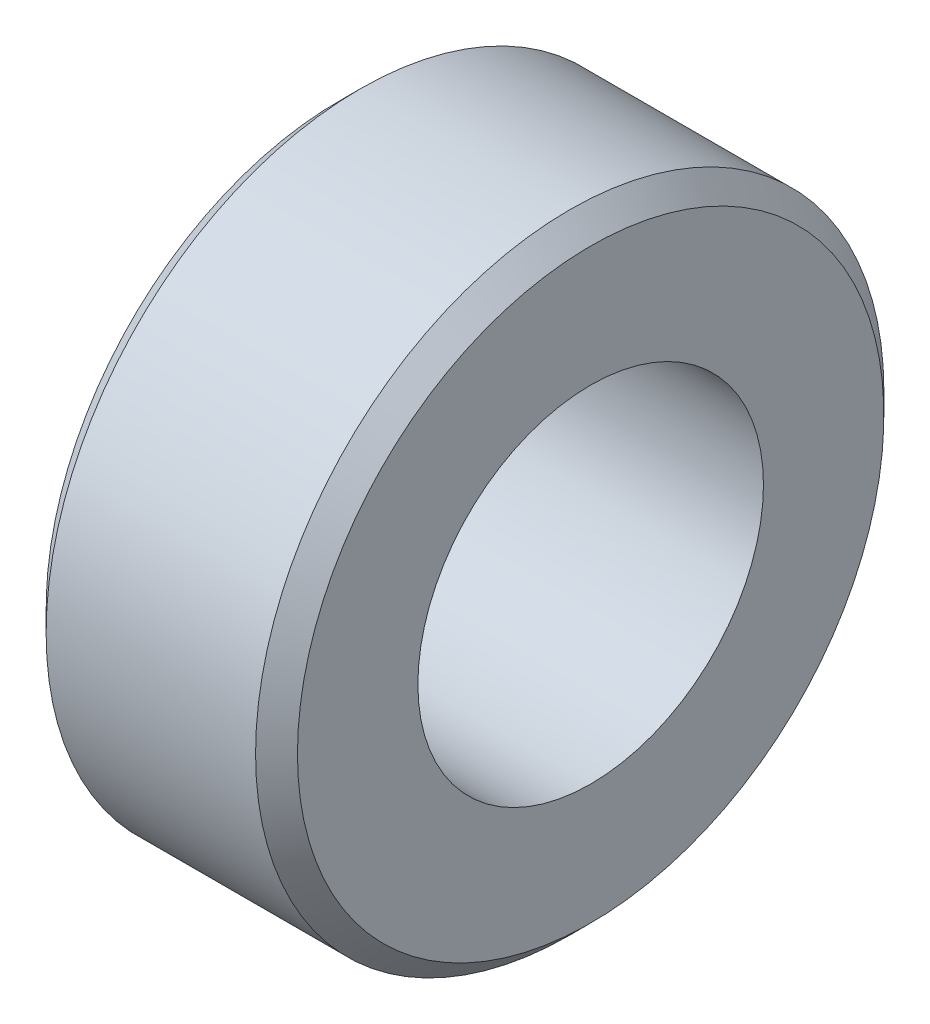
ISO-10303-21;
HEADER;
FILE_DESCRIPTION(('STEP AP214'),'2;1');
FILE_NAME('part.step','',(''),(''),'','','');
FILE_SCHEMA(('AUTOMOTIVE_DESIGN { 1 0 10303 214 1 1 1 1 }'));
ENDSEC;
DATA;
#1=APPLICATION_CONTEXT('core data for automotive mechanical design processes');
#2=APPLICATION_PROTOCOL_DEFINITION('international standard','automotive_design',2000,#1);
#3=PRODUCT_CONTEXT('',#1,'mechanical');
#4=PRODUCT('Part','Part','',(#3));
#5=PRODUCT_RELATED_PRODUCT_CATEGORY('part','',(#4));
#6=PRODUCT_DEFINITION_FORMATION('','',#4);
#7=PRODUCT_DEFINITION_CONTEXT('part definition',#1,'design');
#8=PRODUCT_DEFINITION('design','',#6,#7);
#9=PRODUCT_DEFINITION_SHAPE('','',#8);
#10=(LENGTH_UNIT() NAMED_UNIT(*) SI_UNIT(.MILLI.,.METRE.));
#11=(NAMED_UNIT(*) PLANE_ANGLE_UNIT() SI_UNIT($,.RADIAN.));
#12=(NAMED_UNIT(*) SI_UNIT($,.STERADIAN.) SOLID_ANGLE_UNIT());
#13=UNCERTAINTY_MEASURE_WITH_UNIT(LENGTH_MEASURE(1.E-05),#10,'distance_accuracy_value','');
#14=(GEOMETRIC_REPRESENTATION_CONTEXT(3) GLOBAL_UNCERTAINTY_ASSIGNED_CONTEXT((#13)) GLOBAL_UNIT_ASSIGNED_CONTEXT((#10,
#11,#12)) REPRESENTATION_CONTEXT('',''));
#15=CARTESIAN_POINT('',(0.,0.,0.));
#16=DIRECTION('',(0.,0.,1.));
#17=DIRECTION('',(1.,0.,0.));
#18=AXIS2_PLACEMENT_3D('',#15,#16,#17);
#19=CARTESIAN_POINT('',(6.,0.,0.));
#20=DIRECTION('',(1.,0.,0.));
#21=DIRECTION('',(0.,0.,-1.));
#22=AXIS2_PLACEMENT_3D('',#19,#20,#21);
#23=CYLINDRICAL_SURFACE('',#22,8.25);
#24=CARTESIAN_POINT('',(12.,0.,0.));
#25=DIRECTION('',(1.,0.,0.));
#26=DIRECTION('',(0.,0.,-1.));
#27=AXIS2_PLACEMENT_3D('',#24,#25,#26);
#28=CIRCLE('',#27,8.25);
#29=CARTESIAN_POINT('',(12.,0.,-8.25));
#30=VERTEX_POINT('',#29);
#31=EDGE_CURVE('E38',#30,#30,#28,.F.);
#32=ORIENTED_EDGE('',*,*,#31,.F.);
#33=EDGE_LOOP('',(#32));
#34=FACE_BOUND('',#33,.T.);
#35=CARTESIAN_POINT('',(0.,0.,0.));
#36=DIRECTION('',(1.,0.,0.));
#37=DIRECTION('',(0.,0.,-1.));
#38=AXIS2_PLACEMENT_3D('',#35,#36,#37);
#39=CIRCLE('',#38,8.25);
#40=CARTESIAN_POINT('',(0.,0.,-8.25));
#41=VERTEX_POINT('',#40);
#42=EDGE_CURVE('E18',#41,#41,#39,.T.);
#43=ORIENTED_EDGE('',*,*,#42,.F.);
#44=EDGE_LOOP('',(#43));
#45=FACE_BOUND('',#44,.T.);
#46=ADVANCED_FACE('F15',(#34,#45),#23,.F.);
#47=CARTESIAN_POINT('',(0.,15.,0.));
#48=DIRECTION('',(-1.,0.,0.));
#49=DIRECTION('',(0.,0.,1.));
#50=AXIS2_PLACEMENT_3D('',#47,#48,#49);
#51=PLANE('',#50);
#52=ORIENTED_EDGE('',*,*,#42,.T.);
#53=EDGE_LOOP('',(#52));
#54=FACE_BOUND('',#53,.T.);
#55=CARTESIAN_POINT('',(1.27523859527745E-12,0.,0.));
#56=DIRECTION('',(1.,0.,0.));
#57=DIRECTION('',(0.,0.,-1.));
#58=AXIS2_PLACEMENT_3D('',#55,#56,#57);
#59=CIRCLE('',#58,13.9999999999987);
#60=CARTESIAN_POINT('',(1.27523859527745E-12,0.,-13.9999999999987));
#61=VERTEX_POINT('',#60);
#62=EDGE_CURVE('E36',#61,#61,#59,.T.);
#63=ORIENTED_EDGE('',*,*,#62,.F.);
#64=EDGE_LOOP('',(#63));
#65=FACE_BOUND('',#64,.T.);
#66=ADVANCED_FACE('F45',(#54,#65),#51,.T.);
#67=CARTESIAN_POINT('',(12.,8.25,0.));
#68=DIRECTION('',(1.,0.,0.));
#69=DIRECTION('',(0.,0.,-1.));
#70=AXIS2_PLACEMENT_3D('',#67,#68,#69);
#71=PLANE('',#70);
#72=ORIENTED_EDGE('',*,*,#31,.T.);
#73=EDGE_LOOP('',(#72));
#74=FACE_BOUND('',#73,.T.);
#75=CARTESIAN_POINT('',(11.9999999999987,0.,0.));
#76=DIRECTION('',(-1.,0.,0.));
#77=DIRECTION('',(0.,0.,1.));
#78=AXIS2_PLACEMENT_3D('',#75,#76,#77);
#79=CIRCLE('',#78,13.9999999999987);
#80=CARTESIAN_POINT('',(11.9999999999987,0.,13.9999999999987));
#81=VERTEX_POINT('',#80);
#82=EDGE_CURVE('E27',#81,#81,#79,.T.);
#83=ORIENTED_EDGE('',*,*,#82,.F.);
#84=EDGE_LOOP('',(#83));
#85=FACE_BOUND('',#84,.T.);
#86=ADVANCED_FACE('F54',(#74,#85),#71,.T.);
#87=CARTESIAN_POINT('',(0.999999999998724,0.,0.));
#88=DIRECTION('',(1.,0.,0.));
#89=DIRECTION('',(0.,0.,-1.));
#90=AXIS2_PLACEMENT_3D('',#87,#88,#89);
#91=CONICAL_SURFACE('',#90,15.0000000000013,0.7853981634);
#92=CARTESIAN_POINT('',(0.999999999999999,0.,0.));
#93=DIRECTION('',(1.,0.,0.));
#94=DIRECTION('',(0.,0.,-1.));
#95=AXIS2_PLACEMENT_3D('',#92,#93,#94);
#96=CIRCLE('',#95,15.);
#97=CARTESIAN_POINT('',(0.999999999999999,0.,-15.));
#98=VERTEX_POINT('',#97);
#99=EDGE_CURVE('E22',#98,#98,#96,.T.);
#100=ORIENTED_EDGE('',*,*,#99,.F.);
#101=EDGE_LOOP('',(#100));
#102=FACE_BOUND('',#101,.T.);
#103=ORIENTED_EDGE('',*,*,#62,.T.);
#104=EDGE_LOOP('',(#103));
#105=FACE_BOUND('',#104,.T.);
#106=ADVANCED_FACE('F62',(#102,#105),#91,.T.);
#107=CARTESIAN_POINT('',(11.0000000000013,0.,0.));
#108=DIRECTION('',(-1.,0.,0.));
#109=DIRECTION('',(0.,0.,1.));
#110=AXIS2_PLACEMENT_3D('',#107,#108,#109);
#111=CONICAL_SURFACE('',#110,15.0000000000013,0.7853981634);
#112=ORIENTED_EDGE('',*,*,#82,.T.);
#113=EDGE_LOOP('',(#112));
#114=FACE_BOUND('',#113,.T.);
#115=CARTESIAN_POINT('',(11.,0.,0.));
#116=DIRECTION('',(1.,0.,0.));
#117=DIRECTION('',(0.,0.,-1.));
#118=AXIS2_PLACEMENT_3D('',#115,#116,#117);
#119=CIRCLE('',#118,15.);
#120=CARTESIAN_POINT('',(11.,0.,-15.));
#121=VERTEX_POINT('',#120);
#122=EDGE_CURVE('E10',#121,#121,#119,.F.);
#123=ORIENTED_EDGE('',*,*,#122,.F.);
#124=EDGE_LOOP('',(#123));
#125=FACE_BOUND('',#124,.T.);
#126=ADVANCED_FACE('F57',(#114,#125),#111,.T.);
#127=CARTESIAN_POINT('',(6.,0.,0.));
#128=DIRECTION('',(1.,0.,0.));
#129=DIRECTION('',(0.,0.,-1.));
#130=AXIS2_PLACEMENT_3D('',#127,#128,#129);
#131=CYLINDRICAL_SURFACE('',#130,15.);
#132=ORIENTED_EDGE('',*,*,#122,.T.);
#133=EDGE_LOOP('',(#132));
#134=FACE_BOUND('',#133,.T.);
#135=ORIENTED_EDGE('',*,*,#99,.T.);
#136=EDGE_LOOP('',(#135));
#137=FACE_BOUND('',#136,.T.);
#138=ADVANCED_FACE('F55',(#134,#137),#131,.T.);
#139=CLOSED_SHELL('',(#46,#66,#86,#106,#126,#138));
#140=MANIFOLD_SOLID_BREP('B1',#139);
#141=ADVANCED_BREP_SHAPE_REPRESENTATION('',(#18,#140),#14);
#142=SHAPE_DEFINITION_REPRESENTATION(#9,#141);
ENDSEC;
END-ISO-10303-21;
